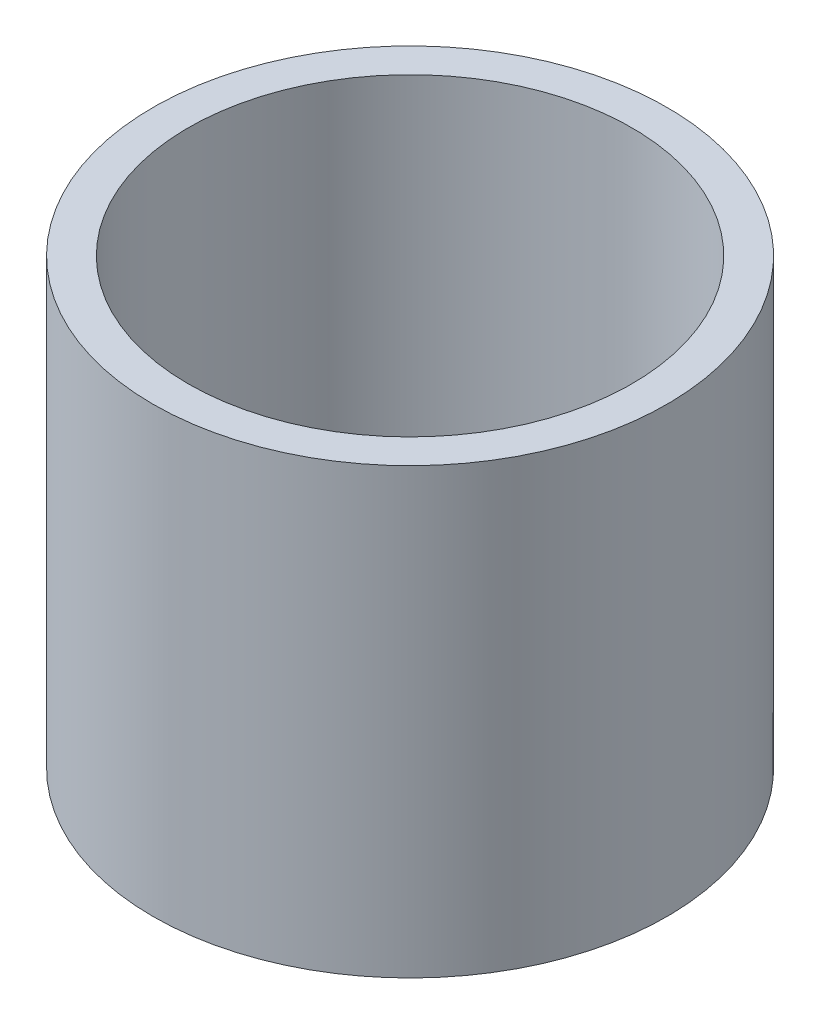
ISO-10303-21;
HEADER;
FILE_DESCRIPTION(('STEP AP214'),'2;1');
FILE_NAME('part.step','',(''),(''),'','','');
FILE_SCHEMA(('AUTOMOTIVE_DESIGN { 1 0 10303 214 1 1 1 1 }'));
ENDSEC;
DATA;
#1=APPLICATION_CONTEXT('core data for automotive mechanical design processes');
#2=APPLICATION_PROTOCOL_DEFINITION('international standard','automotive_design',2000,#1);
#3=PRODUCT_CONTEXT('',#1,'mechanical');
#4=PRODUCT('Part','Part','',(#3));
#5=PRODUCT_RELATED_PRODUCT_CATEGORY('part','',(#4));
#6=PRODUCT_DEFINITION_FORMATION('','',#4);
#7=PRODUCT_DEFINITION_CONTEXT('part definition',#1,'design');
#8=PRODUCT_DEFINITION('design','',#6,#7);
#9=PRODUCT_DEFINITION_SHAPE('','',#8);
#10=(LENGTH_UNIT() NAMED_UNIT(*) SI_UNIT(.MILLI.,.METRE.));
#11=(NAMED_UNIT(*) PLANE_ANGLE_UNIT() SI_UNIT($,.RADIAN.));
#12=(NAMED_UNIT(*) SI_UNIT($,.STERADIAN.) SOLID_ANGLE_UNIT());
#13=UNCERTAINTY_MEASURE_WITH_UNIT(LENGTH_MEASURE(1.E-05),#10,'distance_accuracy_value','');
#14=(GEOMETRIC_REPRESENTATION_CONTEXT(3) GLOBAL_UNCERTAINTY_ASSIGNED_CONTEXT((#13)) GLOBAL_UNIT_ASSIGNED_CONTEXT((#10,
#11,#12)) REPRESENTATION_CONTEXT('',''));
#15=CARTESIAN_POINT('',(0.,0.,0.));
#16=DIRECTION('',(0.,0.,1.));
#17=DIRECTION('',(1.,0.,0.));
#18=AXIS2_PLACEMENT_3D('',#15,#16,#17);
#19=CARTESIAN_POINT('',(0.,40.,0.));
#20=DIRECTION('',(0.,1.,0.));
#21=DIRECTION('',(0.,0.,1.));
#22=AXIS2_PLACEMENT_3D('',#19,#20,#21);
#23=PLANE('',#22);
#24=CARTESIAN_POINT('',(0.,40.,0.));
#25=DIRECTION('',(0.,1.,0.));
#26=DIRECTION('',(0.,0.,1.));
#27=AXIS2_PLACEMENT_3D('',#24,#25,#26);
#28=CIRCLE('',#27,23.175);
#29=CARTESIAN_POINT('',(0.,40.,23.175));
#30=VERTEX_POINT('',#29);
#31=EDGE_CURVE('E10',#30,#30,#28,.T.);
#32=ORIENTED_EDGE('',*,*,#31,.T.);
#33=EDGE_LOOP('',(#32));
#34=FACE_BOUND('',#33,.T.);
#35=CARTESIAN_POINT('',(0.,40.,0.));
#36=DIRECTION('',(0.,1.,0.));
#37=DIRECTION('',(0.,0.,1.));
#38=AXIS2_PLACEMENT_3D('',#35,#36,#37);
#39=CIRCLE('',#38,20.);
#40=CARTESIAN_POINT('',(0.,40.,20.));
#41=VERTEX_POINT('',#40);
#42=EDGE_CURVE('E56',#41,#41,#39,.T.);
#43=ORIENTED_EDGE('',*,*,#42,.F.);
#44=EDGE_LOOP('',(#43));
#45=FACE_BOUND('',#44,.T.);
#46=ADVANCED_FACE('F43',(#34,#45),#23,.T.);
#47=CARTESIAN_POINT('',(0.,0.,0.));
#48=DIRECTION('',(0.,1.,0.));
#49=DIRECTION('',(0.,0.,1.));
#50=AXIS2_PLACEMENT_3D('',#47,#48,#49);
#51=PLANE('',#50);
#52=CARTESIAN_POINT('',(0.,0.,0.));
#53=DIRECTION('',(0.,1.,0.));
#54=DIRECTION('',(0.,0.,1.));
#55=AXIS2_PLACEMENT_3D('',#52,#53,#54);
#56=CIRCLE('',#55,23.175);
#57=CARTESIAN_POINT('',(0.,0.,23.175));
#58=VERTEX_POINT('',#57);
#59=EDGE_CURVE('E47',#58,#58,#56,.T.);
#60=ORIENTED_EDGE('',*,*,#59,.F.);
#61=EDGE_LOOP('',(#60));
#62=FACE_BOUND('',#61,.T.);
#63=CARTESIAN_POINT('',(0.,0.,0.));
#64=DIRECTION('',(0.,1.,0.));
#65=DIRECTION('',(0.,0.,1.));
#66=AXIS2_PLACEMENT_3D('',#63,#64,#65);
#67=CIRCLE('',#66,20.);
#68=CARTESIAN_POINT('',(0.,0.,20.));
#69=VERTEX_POINT('',#68);
#70=EDGE_CURVE('E58',#69,#69,#67,.T.);
#71=ORIENTED_EDGE('',*,*,#70,.T.);
#72=EDGE_LOOP('',(#71));
#73=FACE_BOUND('',#72,.T.);
#74=ADVANCED_FACE('F70',(#62,#73),#51,.F.);
#75=CARTESIAN_POINT('',(0.,40.,0.));
#76=DIRECTION('',(0.,-1.,0.));
#77=DIRECTION('',(0.,0.,-1.));
#78=AXIS2_PLACEMENT_3D('',#75,#76,#77);
#79=CYLINDRICAL_SURFACE('',#78,23.175);
#80=ORIENTED_EDGE('',*,*,#31,.F.);
#81=EDGE_LOOP('',(#80));
#82=FACE_BOUND('',#81,.T.);
#83=ORIENTED_EDGE('',*,*,#59,.T.);
#84=EDGE_LOOP('',(#83));
#85=FACE_BOUND('',#84,.T.);
#86=ADVANCED_FACE('F45',(#82,#85),#79,.T.);
#87=CARTESIAN_POINT('',(0.,40.,0.));
#88=DIRECTION('',(0.,-1.,0.));
#89=DIRECTION('',(0.,0.,-1.));
#90=AXIS2_PLACEMENT_3D('',#87,#88,#89);
#91=CYLINDRICAL_SURFACE('',#90,20.);
#92=ORIENTED_EDGE('',*,*,#42,.T.);
#93=EDGE_LOOP('',(#92));
#94=FACE_BOUND('',#93,.T.);
#95=ORIENTED_EDGE('',*,*,#70,.F.);
#96=EDGE_LOOP('',(#95));
#97=FACE_BOUND('',#96,.T.);
#98=ADVANCED_FACE('F66',(#94,#97),#91,.F.);
#99=CLOSED_SHELL('',(#46,#74,#86,#98));
#100=MANIFOLD_SOLID_BREP('B2',#99);
#101=ADVANCED_BREP_SHAPE_REPRESENTATION('',(#18,#100),#14);
#102=SHAPE_DEFINITION_REPRESENTATION(#9,#101);
ENDSEC;
END-ISO-10303-21;
